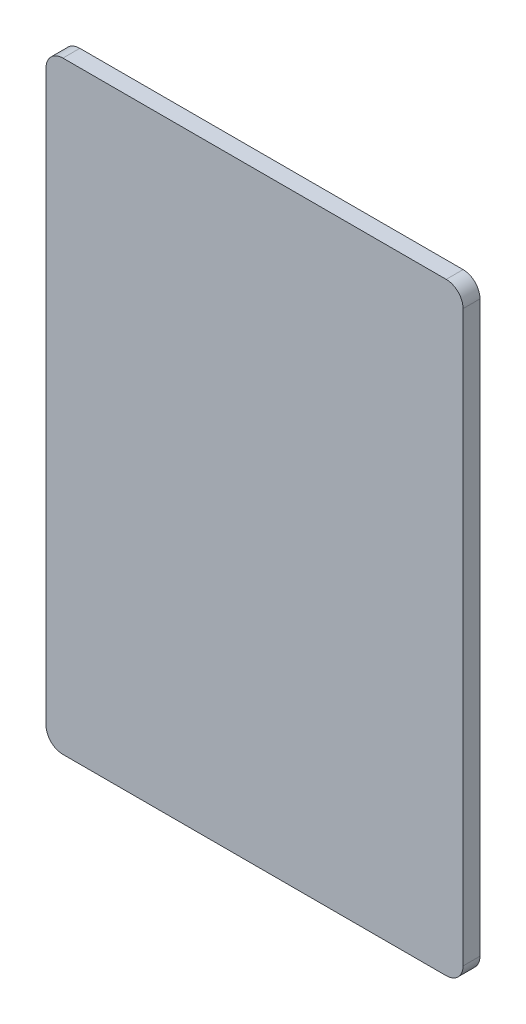
ISO-10303-21;
HEADER;
FILE_DESCRIPTION(('STEP AP214'),'2;1');
FILE_NAME('part.step','',(''),(''),'','','');
FILE_SCHEMA(('AUTOMOTIVE_DESIGN { 1 0 10303 214 1 1 1 1 }'));
ENDSEC;
DATA;
#1=APPLICATION_CONTEXT('core data for automotive mechanical design processes');
#2=APPLICATION_PROTOCOL_DEFINITION('international standard','automotive_design',2000,#1);
#3=PRODUCT_CONTEXT('',#1,'mechanical');
#4=PRODUCT('Part','Part','',(#3));
#5=PRODUCT_RELATED_PRODUCT_CATEGORY('part','',(#4));
#6=PRODUCT_DEFINITION_FORMATION('','',#4);
#7=PRODUCT_DEFINITION_CONTEXT('part definition',#1,'design');
#8=PRODUCT_DEFINITION('design','',#6,#7);
#9=PRODUCT_DEFINITION_SHAPE('','',#8);
#10=(LENGTH_UNIT() NAMED_UNIT(*) SI_UNIT(.MILLI.,.METRE.));
#11=(NAMED_UNIT(*) PLANE_ANGLE_UNIT() SI_UNIT($,.RADIAN.));
#12=(NAMED_UNIT(*) SI_UNIT($,.STERADIAN.) SOLID_ANGLE_UNIT());
#13=UNCERTAINTY_MEASURE_WITH_UNIT(LENGTH_MEASURE(1.E-05),#10,'distance_accuracy_value','');
#14=(GEOMETRIC_REPRESENTATION_CONTEXT(3) GLOBAL_UNCERTAINTY_ASSIGNED_CONTEXT((#13)) GLOBAL_UNIT_ASSIGNED_CONTEXT((#10,
#11,#12)) REPRESENTATION_CONTEXT('',''));
#15=CARTESIAN_POINT('',(0.,0.,0.));
#16=DIRECTION('',(0.,0.,1.));
#17=DIRECTION('',(1.,0.,0.));
#18=AXIS2_PLACEMENT_3D('',#15,#16,#17);
#19=CARTESIAN_POINT('',(37.,53.5,-3.));
#20=DIRECTION('',(1.,0.,0.));
#21=DIRECTION('',(0.,1.,0.));
#22=AXIS2_PLACEMENT_3D('',#19,#20,#21);
#23=PLANE('',#22);
#24=DIRECTION('',(0.,1.,0.));
#25=VECTOR('',#24,1.);
#26=CARTESIAN_POINT('',(37.,53.5,0.));
#27=LINE('',#26,#25);
#28=CARTESIAN_POINT('',(37.,-50.5,0.));
#29=VERTEX_POINT('',#28);
#30=CARTESIAN_POINT('',(37.,50.5,0.));
#31=VERTEX_POINT('',#30);
#32=EDGE_CURVE('E162',#29,#31,#27,.T.);
#33=ORIENTED_EDGE('',*,*,#32,.F.);
#34=DIRECTION('',(0.,0.,1.));
#35=VECTOR('',#34,1.);
#36=CARTESIAN_POINT('',(37.,-50.5,-3.));
#37=LINE('',#36,#35);
#38=CARTESIAN_POINT('',(37.,-50.5,-3.));
#39=VERTEX_POINT('',#38);
#40=EDGE_CURVE('E142',#29,#39,#37,.F.);
#41=ORIENTED_EDGE('',*,*,#40,.T.);
#42=DIRECTION('',(0.,1.,0.));
#43=VECTOR('',#42,1.);
#44=CARTESIAN_POINT('',(37.,53.5,-3.));
#45=LINE('',#44,#43);
#46=CARTESIAN_POINT('',(37.,50.5,-3.));
#47=VERTEX_POINT('',#46);
#48=EDGE_CURVE('E123',#39,#47,#45,.T.);
#49=ORIENTED_EDGE('',*,*,#48,.T.);
#50=DIRECTION('',(0.,0.,1.));
#51=VECTOR('',#50,1.);
#52=CARTESIAN_POINT('',(37.,50.5,-3.));
#53=LINE('',#52,#51);
#54=EDGE_CURVE('E139',#47,#31,#53,.T.);
#55=ORIENTED_EDGE('',*,*,#54,.T.);
#56=EDGE_LOOP('',(#33,#41,#49,#55));
#57=FACE_BOUND('',#56,.T.);
#58=ADVANCED_FACE('F36',(#57),#23,.T.);
#59=CARTESIAN_POINT('',(-37.,-53.5,-3.));
#60=DIRECTION('',(0.,-1.,0.));
#61=DIRECTION('',(0.,0.,-1.));
#62=AXIS2_PLACEMENT_3D('',#59,#60,#61);
#63=PLANE('',#62);
#64=DIRECTION('',(1.,0.,0.));
#65=VECTOR('',#64,1.);
#66=CARTESIAN_POINT('',(-37.,-53.5,-3.));
#67=LINE('',#66,#65);
#68=CARTESIAN_POINT('',(-34.,-53.5,-3.));
#69=VERTEX_POINT('',#68);
#70=CARTESIAN_POINT('',(34.,-53.5,-3.));
#71=VERTEX_POINT('',#70);
#72=EDGE_CURVE('E128',#69,#71,#67,.T.);
#73=ORIENTED_EDGE('',*,*,#72,.T.);
#74=DIRECTION('',(0.,0.,1.));
#75=VECTOR('',#74,1.);
#76=CARTESIAN_POINT('',(34.,-53.5,-3.));
#77=LINE('',#76,#75);
#78=CARTESIAN_POINT('',(34.,-53.5,0.));
#79=VERTEX_POINT('',#78);
#80=EDGE_CURVE('E122',#71,#79,#77,.T.);
#81=ORIENTED_EDGE('',*,*,#80,.T.);
#82=DIRECTION('',(1.,0.,0.));
#83=VECTOR('',#82,1.);
#84=CARTESIAN_POINT('',(-37.,-53.5,0.));
#85=LINE('',#84,#83);
#86=CARTESIAN_POINT('',(-34.,-53.5,0.));
#87=VERTEX_POINT('',#86);
#88=EDGE_CURVE('E105',#87,#79,#85,.T.);
#89=ORIENTED_EDGE('',*,*,#88,.F.);
#90=DIRECTION('',(0.,0.,1.));
#91=VECTOR('',#90,1.);
#92=CARTESIAN_POINT('',(-34.,-53.5,-3.));
#93=LINE('',#92,#91);
#94=EDGE_CURVE('E119',#87,#69,#93,.F.);
#95=ORIENTED_EDGE('',*,*,#94,.T.);
#96=EDGE_LOOP('',(#73,#81,#89,#95));
#97=FACE_BOUND('',#96,.T.);
#98=ADVANCED_FACE('F118',(#97),#63,.T.);
#99=CARTESIAN_POINT('',(-37.,53.5,-3.));
#100=DIRECTION('',(-1.,0.,0.));
#101=DIRECTION('',(0.,-1.,0.));
#102=AXIS2_PLACEMENT_3D('',#99,#100,#101);
#103=PLANE('',#102);
#104=DIRECTION('',(0.,-1.,0.));
#105=VECTOR('',#104,1.);
#106=CARTESIAN_POINT('',(-37.,53.5,-3.));
#107=LINE('',#106,#105);
#108=CARTESIAN_POINT('',(-37.,50.5,-3.));
#109=VERTEX_POINT('',#108);
#110=CARTESIAN_POINT('',(-37.,-50.5,-3.));
#111=VERTEX_POINT('',#110);
#112=EDGE_CURVE('E132',#109,#111,#107,.T.);
#113=ORIENTED_EDGE('',*,*,#112,.T.);
#114=DIRECTION('',(0.,0.,1.));
#115=VECTOR('',#114,1.);
#116=CARTESIAN_POINT('',(-37.,-50.5,-3.));
#117=LINE('',#116,#115);
#118=CARTESIAN_POINT('',(-37.,-50.5,0.));
#119=VERTEX_POINT('',#118);
#120=EDGE_CURVE('E152',#111,#119,#117,.T.);
#121=ORIENTED_EDGE('',*,*,#120,.T.);
#122=DIRECTION('',(0.,-1.,0.));
#123=VECTOR('',#122,1.);
#124=CARTESIAN_POINT('',(-37.,53.5,0.));
#125=LINE('',#124,#123);
#126=CARTESIAN_POINT('',(-37.,50.5,0.));
#127=VERTEX_POINT('',#126);
#128=EDGE_CURVE('E107',#127,#119,#125,.T.);
#129=ORIENTED_EDGE('',*,*,#128,.F.);
#130=DIRECTION('',(0.,0.,1.));
#131=VECTOR('',#130,1.);
#132=CARTESIAN_POINT('',(-37.,50.5,-3.));
#133=LINE('',#132,#131);
#134=EDGE_CURVE('E150',#127,#109,#133,.F.);
#135=ORIENTED_EDGE('',*,*,#134,.T.);
#136=EDGE_LOOP('',(#113,#121,#129,#135));
#137=FACE_BOUND('',#136,.T.);
#138=ADVANCED_FACE('F155',(#137),#103,.T.);
#139=CARTESIAN_POINT('',(-37.,53.5,-3.));
#140=DIRECTION('',(0.,1.,0.));
#141=DIRECTION('',(0.,0.,1.));
#142=AXIS2_PLACEMENT_3D('',#139,#140,#141);
#143=PLANE('',#142);
#144=DIRECTION('',(-1.,0.,0.));
#145=VECTOR('',#144,1.);
#146=CARTESIAN_POINT('',(-37.,53.5,-3.));
#147=LINE('',#146,#145);
#148=CARTESIAN_POINT('',(34.,53.5,-3.));
#149=VERTEX_POINT('',#148);
#150=CARTESIAN_POINT('',(-34.,53.5,-3.));
#151=VERTEX_POINT('',#150);
#152=EDGE_CURVE('E157',#149,#151,#147,.T.);
#153=ORIENTED_EDGE('',*,*,#152,.T.);
#154=DIRECTION('',(0.,0.,1.));
#155=VECTOR('',#154,1.);
#156=CARTESIAN_POINT('',(-34.,53.5,-3.));
#157=LINE('',#156,#155);
#158=CARTESIAN_POINT('',(-34.,53.5,0.));
#159=VERTEX_POINT('',#158);
#160=EDGE_CURVE('E11',#151,#159,#157,.T.);
#161=ORIENTED_EDGE('',*,*,#160,.T.);
#162=DIRECTION('',(-1.,0.,0.));
#163=VECTOR('',#162,1.);
#164=CARTESIAN_POINT('',(-37.,53.5,0.));
#165=LINE('',#164,#163);
#166=CARTESIAN_POINT('',(34.,53.5,0.));
#167=VERTEX_POINT('',#166);
#168=EDGE_CURVE('E165',#167,#159,#165,.T.);
#169=ORIENTED_EDGE('',*,*,#168,.F.);
#170=DIRECTION('',(0.,0.,1.));
#171=VECTOR('',#170,1.);
#172=CARTESIAN_POINT('',(34.,53.5,-3.));
#173=LINE('',#172,#171);
#174=EDGE_CURVE('E44',#167,#149,#173,.F.);
#175=ORIENTED_EDGE('',*,*,#174,.T.);
#176=EDGE_LOOP('',(#153,#161,#169,#175));
#177=FACE_BOUND('',#176,.T.);
#178=ADVANCED_FACE('F167',(#177),#143,.T.);
#179=CARTESIAN_POINT('',(0.,0.,-3.));
#180=DIRECTION('',(0.,0.,1.));
#181=DIRECTION('',(1.,0.,0.));
#182=AXIS2_PLACEMENT_3D('',#179,#180,#181);
#183=PLANE('',#182);
#184=ORIENTED_EDGE('',*,*,#48,.F.);
#185=CARTESIAN_POINT('',(34.,-50.5,-3.));
#186=DIRECTION('',(0.,0.,1.));
#187=DIRECTION('',(1.,0.,0.));
#188=AXIS2_PLACEMENT_3D('',#185,#186,#187);
#189=CIRCLE('',#188,3.);
#190=EDGE_CURVE('E148',#39,#71,#189,.F.);
#191=ORIENTED_EDGE('',*,*,#190,.T.);
#192=ORIENTED_EDGE('',*,*,#72,.F.);
#193=CARTESIAN_POINT('',(-34.,-50.5,-3.));
#194=DIRECTION('',(0.,0.,1.));
#195=DIRECTION('',(1.,0.,0.));
#196=AXIS2_PLACEMENT_3D('',#193,#194,#195);
#197=CIRCLE('',#196,3.);
#198=EDGE_CURVE('E127',#69,#111,#197,.F.);
#199=ORIENTED_EDGE('',*,*,#198,.T.);
#200=ORIENTED_EDGE('',*,*,#112,.F.);
#201=CARTESIAN_POINT('',(-34.,50.5,-3.));
#202=DIRECTION('',(0.,0.,1.));
#203=DIRECTION('',(1.,0.,0.));
#204=AXIS2_PLACEMENT_3D('',#201,#202,#203);
#205=CIRCLE('',#204,3.);
#206=EDGE_CURVE('E51',#109,#151,#205,.F.);
#207=ORIENTED_EDGE('',*,*,#206,.T.);
#208=ORIENTED_EDGE('',*,*,#152,.F.);
#209=CARTESIAN_POINT('',(34.,50.5,-3.));
#210=DIRECTION('',(0.,0.,1.));
#211=DIRECTION('',(1.,0.,0.));
#212=AXIS2_PLACEMENT_3D('',#209,#210,#211);
#213=CIRCLE('',#212,3.);
#214=EDGE_CURVE('E144',#149,#47,#213,.F.);
#215=ORIENTED_EDGE('',*,*,#214,.T.);
#216=EDGE_LOOP('',(#184,#191,#192,#199,#200,#207,#208,#215));
#217=FACE_BOUND('',#216,.T.);
#218=ADVANCED_FACE('F174',(#217),#183,.F.);
#219=CARTESIAN_POINT('',(0.,0.,0.));
#220=DIRECTION('',(0.,0.,1.));
#221=DIRECTION('',(1.,0.,0.));
#222=AXIS2_PLACEMENT_3D('',#219,#220,#221);
#223=PLANE('',#222);
#224=ORIENTED_EDGE('',*,*,#88,.T.);
#225=CARTESIAN_POINT('',(34.,-50.5,0.));
#226=DIRECTION('',(0.,0.,1.));
#227=DIRECTION('',(1.,0.,0.));
#228=AXIS2_PLACEMENT_3D('',#225,#226,#227);
#229=CIRCLE('',#228,3.);
#230=EDGE_CURVE('E112',#79,#29,#229,.T.);
#231=ORIENTED_EDGE('',*,*,#230,.T.);
#232=ORIENTED_EDGE('',*,*,#32,.T.);
#233=CARTESIAN_POINT('',(34.,50.5,0.));
#234=DIRECTION('',(0.,0.,1.));
#235=DIRECTION('',(1.,0.,0.));
#236=AXIS2_PLACEMENT_3D('',#233,#234,#235);
#237=CIRCLE('',#236,3.);
#238=EDGE_CURVE('E130',#31,#167,#237,.T.);
#239=ORIENTED_EDGE('',*,*,#238,.T.);
#240=ORIENTED_EDGE('',*,*,#168,.T.);
#241=CARTESIAN_POINT('',(-34.,50.5,0.));
#242=DIRECTION('',(0.,0.,1.));
#243=DIRECTION('',(1.,0.,0.));
#244=AXIS2_PLACEMENT_3D('',#241,#242,#243);
#245=CIRCLE('',#244,3.);
#246=EDGE_CURVE('E113',#159,#127,#245,.T.);
#247=ORIENTED_EDGE('',*,*,#246,.T.);
#248=ORIENTED_EDGE('',*,*,#128,.T.);
#249=CARTESIAN_POINT('',(-34.,-50.5,0.));
#250=DIRECTION('',(0.,0.,1.));
#251=DIRECTION('',(1.,0.,0.));
#252=AXIS2_PLACEMENT_3D('',#249,#250,#251);
#253=CIRCLE('',#252,3.);
#254=EDGE_CURVE('E102',#119,#87,#253,.T.);
#255=ORIENTED_EDGE('',*,*,#254,.T.);
#256=EDGE_LOOP('',(#224,#231,#232,#239,#240,#247,#248,#255));
#257=FACE_BOUND('',#256,.T.);
#258=ADVANCED_FACE('F104',(#257),#223,.T.);
#259=CARTESIAN_POINT('',(34.,-50.5,-3.));
#260=DIRECTION('',(0.,0.,1.));
#261=DIRECTION('',(1.,0.,0.));
#262=AXIS2_PLACEMENT_3D('',#259,#260,#261);
#263=CYLINDRICAL_SURFACE('',#262,3.);
#264=ORIENTED_EDGE('',*,*,#190,.F.);
#265=ORIENTED_EDGE('',*,*,#40,.F.);
#266=ORIENTED_EDGE('',*,*,#230,.F.);
#267=ORIENTED_EDGE('',*,*,#80,.F.);
#268=EDGE_LOOP('',(#264,#265,#266,#267));
#269=FACE_BOUND('',#268,.T.);
#270=ADVANCED_FACE('F180',(#269),#263,.T.);
#271=CARTESIAN_POINT('',(-34.,-50.5,-3.));
#272=DIRECTION('',(0.,0.,1.));
#273=DIRECTION('',(1.,0.,0.));
#274=AXIS2_PLACEMENT_3D('',#271,#272,#273);
#275=CYLINDRICAL_SURFACE('',#274,3.);
#276=ORIENTED_EDGE('',*,*,#198,.F.);
#277=ORIENTED_EDGE('',*,*,#94,.F.);
#278=ORIENTED_EDGE('',*,*,#254,.F.);
#279=ORIENTED_EDGE('',*,*,#120,.F.);
#280=EDGE_LOOP('',(#276,#277,#278,#279));
#281=FACE_BOUND('',#280,.T.);
#282=ADVANCED_FACE('F126',(#281),#275,.T.);
#283=CARTESIAN_POINT('',(-34.,50.5,-3.));
#284=DIRECTION('',(0.,0.,1.));
#285=DIRECTION('',(1.,0.,0.));
#286=AXIS2_PLACEMENT_3D('',#283,#284,#285);
#287=CYLINDRICAL_SURFACE('',#286,3.);
#288=ORIENTED_EDGE('',*,*,#206,.F.);
#289=ORIENTED_EDGE('',*,*,#134,.F.);
#290=ORIENTED_EDGE('',*,*,#246,.F.);
#291=ORIENTED_EDGE('',*,*,#160,.F.);
#292=EDGE_LOOP('',(#288,#289,#290,#291));
#293=FACE_BOUND('',#292,.T.);
#294=ADVANCED_FACE('F187',(#293),#287,.T.);
#295=CARTESIAN_POINT('',(34.,50.5,-3.));
#296=DIRECTION('',(0.,0.,1.));
#297=DIRECTION('',(1.,0.,0.));
#298=AXIS2_PLACEMENT_3D('',#295,#296,#297);
#299=CYLINDRICAL_SURFACE('',#298,3.);
#300=ORIENTED_EDGE('',*,*,#214,.F.);
#301=ORIENTED_EDGE('',*,*,#174,.F.);
#302=ORIENTED_EDGE('',*,*,#238,.F.);
#303=ORIENTED_EDGE('',*,*,#54,.F.);
#304=EDGE_LOOP('',(#300,#301,#302,#303));
#305=FACE_BOUND('',#304,.T.);
#306=ADVANCED_FACE('F38',(#305),#299,.T.);
#307=CLOSED_SHELL('',(#58,#98,#138,#178,#218,#258,#270,#282,#294,#306));
#308=MANIFOLD_SOLID_BREP('B2',#307);
#309=ADVANCED_BREP_SHAPE_REPRESENTATION('',(#18,#308),#14);
#310=SHAPE_DEFINITION_REPRESENTATION(#9,#309);
ENDSEC;
END-ISO-10303-21;
